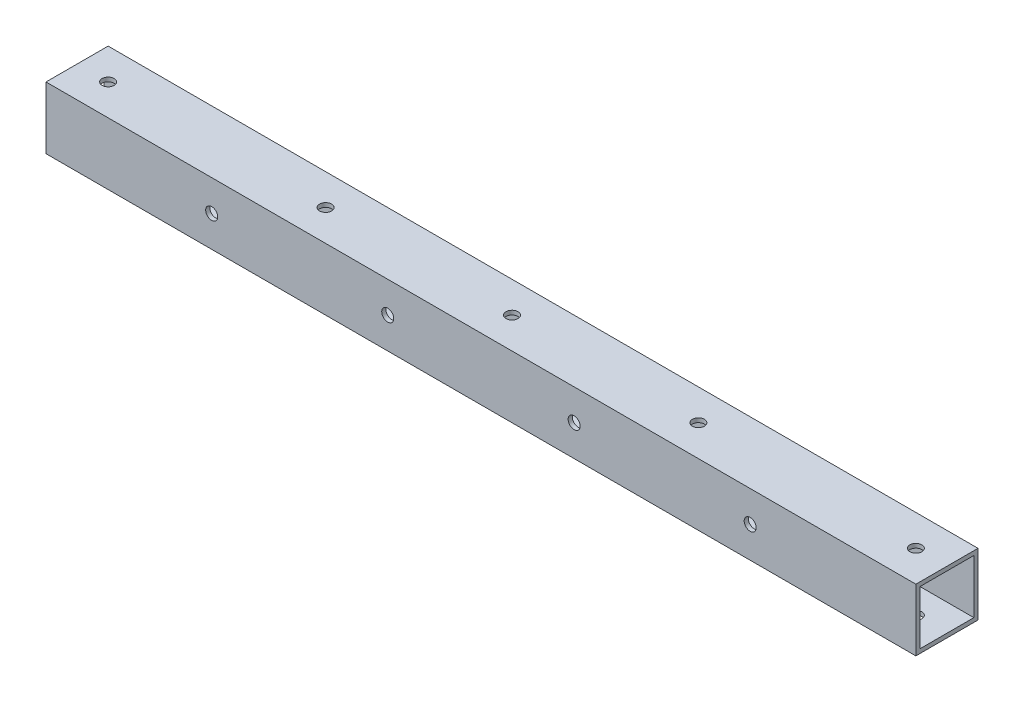
ISO-10303-21;
HEADER;
FILE_DESCRIPTION(('STEP AP214'),'2;1');
FILE_NAME('part.step','',(''),(''),'','','');
FILE_SCHEMA(('AUTOMOTIVE_DESIGN { 1 0 10303 214 1 1 1 1 }'));
ENDSEC;
DATA;
#1=APPLICATION_CONTEXT('core data for automotive mechanical design processes');
#2=APPLICATION_PROTOCOL_DEFINITION('international standard','automotive_design',2000,#1);
#3=PRODUCT_CONTEXT('',#1,'mechanical');
#4=PRODUCT('Part','Part','',(#3));
#5=PRODUCT_RELATED_PRODUCT_CATEGORY('part','',(#4));
#6=PRODUCT_DEFINITION_FORMATION('','',#4);
#7=PRODUCT_DEFINITION_CONTEXT('part definition',#1,'design');
#8=PRODUCT_DEFINITION('design','',#6,#7);
#9=PRODUCT_DEFINITION_SHAPE('','',#8);
#10=(LENGTH_UNIT() NAMED_UNIT(*) SI_UNIT(.MILLI.,.METRE.));
#11=(NAMED_UNIT(*) PLANE_ANGLE_UNIT() SI_UNIT($,.RADIAN.));
#12=(NAMED_UNIT(*) SI_UNIT($,.STERADIAN.) SOLID_ANGLE_UNIT());
#13=UNCERTAINTY_MEASURE_WITH_UNIT(LENGTH_MEASURE(1.E-05),#10,'distance_accuracy_value','');
#14=(GEOMETRIC_REPRESENTATION_CONTEXT(3) GLOBAL_UNCERTAINTY_ASSIGNED_CONTEXT((#13)) GLOBAL_UNIT_ASSIGNED_CONTEXT((#10,
#11,#12)) REPRESENTATION_CONTEXT('',''));
#15=CARTESIAN_POINT('',(0.,0.,0.));
#16=DIRECTION('',(0.,0.,1.));
#17=DIRECTION('',(1.,0.,0.));
#18=AXIS2_PLACEMENT_3D('',#15,#16,#17);
#19=CARTESIAN_POINT('',(105.,-6.50000000000001,-6.49999999999999));
#20=DIRECTION('',(0.,0.,1.));
#21=DIRECTION('',(1.,0.,0.));
#22=AXIS2_PLACEMENT_3D('',#19,#20,#21);
#23=PLANE('',#22);
#24=CARTESIAN_POINT('',(-65.,0.,-6.49999999999999));
#25=DIRECTION('',(0.,0.,1.));
#26=DIRECTION('',(1.,0.,0.));
#27=AXIS2_PLACEMENT_3D('',#24,#25,#26);
#28=CIRCLE('',#27,1.45);
#29=CARTESIAN_POINT('',(-63.55,0.,-6.49999999999999));
#30=VERTEX_POINT('',#29);
#31=EDGE_CURVE('E168',#30,#30,#28,.T.);
#32=ORIENTED_EDGE('',*,*,#31,.F.);
#33=EDGE_LOOP('',(#32));
#34=FACE_BOUND('',#33,.T.);
#35=CARTESIAN_POINT('',(22.5,0.,-6.49999999999999));
#36=DIRECTION('',(0.,0.,1.));
#37=DIRECTION('',(1.,0.,0.));
#38=AXIS2_PLACEMENT_3D('',#35,#36,#37);
#39=CIRCLE('',#38,1.45);
#40=CARTESIAN_POINT('',(23.95,0.,-6.49999999999999));
#41=VERTEX_POINT('',#40);
#42=EDGE_CURVE('E339',#41,#41,#39,.T.);
#43=ORIENTED_EDGE('',*,*,#42,.F.);
#44=EDGE_LOOP('',(#43));
#45=FACE_BOUND('',#44,.T.);
#46=CARTESIAN_POINT('',(65.,0.,-6.49999999999999));
#47=DIRECTION('',(0.,0.,1.));
#48=DIRECTION('',(1.,0.,0.));
#49=AXIS2_PLACEMENT_3D('',#46,#47,#48);
#50=CIRCLE('',#49,1.45);
#51=CARTESIAN_POINT('',(66.45,0.,-6.49999999999999));
#52=VERTEX_POINT('',#51);
#53=EDGE_CURVE('E331',#52,#52,#50,.T.);
#54=ORIENTED_EDGE('',*,*,#53,.F.);
#55=EDGE_LOOP('',(#54));
#56=FACE_BOUND('',#55,.T.);
#57=CARTESIAN_POINT('',(-22.5,0.,-6.49999999999999));
#58=DIRECTION('',(0.,0.,1.));
#59=DIRECTION('',(1.,0.,0.));
#60=AXIS2_PLACEMENT_3D('',#57,#58,#59);
#61=CIRCLE('',#60,1.45);
#62=CARTESIAN_POINT('',(-21.05,0.,-6.49999999999999));
#63=VERTEX_POINT('',#62);
#64=EDGE_CURVE('E323',#63,#63,#61,.T.);
#65=ORIENTED_EDGE('',*,*,#64,.F.);
#66=EDGE_LOOP('',(#65));
#67=FACE_BOUND('',#66,.T.);
#68=DIRECTION('',(0.,1.,0.));
#69=VECTOR('',#68,1.);
#70=CARTESIAN_POINT('',(-105.,-6.50000000000001,-6.49999999999999));
#71=LINE('',#70,#69);
#72=CARTESIAN_POINT('',(-105.,-6.50000000000001,-6.49999999999999));
#73=VERTEX_POINT('',#72);
#74=CARTESIAN_POINT('',(-105.,6.49999999999999,-6.49999999999999));
#75=VERTEX_POINT('',#74);
#76=EDGE_CURVE('E177',#73,#75,#71,.T.);
#77=ORIENTED_EDGE('',*,*,#76,.F.);
#78=DIRECTION('',(-1.,0.,0.));
#79=VECTOR('',#78,1.);
#80=CARTESIAN_POINT('',(105.,-6.50000000000001,-6.49999999999999));
#81=LINE('',#80,#79);
#82=CARTESIAN_POINT('',(105.,-6.50000000000001,-6.49999999999999));
#83=VERTEX_POINT('',#82);
#84=EDGE_CURVE('E12',#83,#73,#81,.T.);
#85=ORIENTED_EDGE('',*,*,#84,.F.);
#86=DIRECTION('',(0.,1.,0.));
#87=VECTOR('',#86,1.);
#88=CARTESIAN_POINT('',(105.,-6.50000000000001,-6.49999999999999));
#89=LINE('',#88,#87);
#90=CARTESIAN_POINT('',(105.,6.49999999999999,-6.49999999999999));
#91=VERTEX_POINT('',#90);
#92=EDGE_CURVE('E151',#83,#91,#89,.T.);
#93=ORIENTED_EDGE('',*,*,#92,.T.);
#94=DIRECTION('',(-1.,0.,0.));
#95=VECTOR('',#94,1.);
#96=CARTESIAN_POINT('',(105.,6.49999999999999,-6.49999999999999));
#97=LINE('',#96,#95);
#98=EDGE_CURVE('E81',#91,#75,#97,.T.);
#99=ORIENTED_EDGE('',*,*,#98,.T.);
#100=EDGE_LOOP('',(#77,#85,#93,#99));
#101=FACE_BOUND('',#100,.T.);
#102=ADVANCED_FACE('F61',(#34,#45,#56,#67,#101),#23,.T.);
#103=CARTESIAN_POINT('',(105.,-6.50000000000001,6.50000000000001));
#104=DIRECTION('',(0.,1.,0.));
#105=DIRECTION('',(0.,0.,1.));
#106=AXIS2_PLACEMENT_3D('',#103,#104,#105);
#107=PLANE('',#106);
#108=CARTESIAN_POINT('',(-97.5,-6.50000000000001,0.));
#109=DIRECTION('',(0.,1.,0.));
#110=DIRECTION('',(0.,0.,1.));
#111=AXIS2_PLACEMENT_3D('',#108,#109,#110);
#112=CIRCLE('',#111,1.45);
#113=CARTESIAN_POINT('',(-97.5,-6.50000000000001,1.45));
#114=VERTEX_POINT('',#113);
#115=EDGE_CURVE('E251',#114,#114,#112,.T.);
#116=ORIENTED_EDGE('',*,*,#115,.F.);
#117=EDGE_LOOP('',(#116));
#118=FACE_BOUND('',#117,.T.);
#119=CARTESIAN_POINT('',(97.5,-6.50000000000001,0.));
#120=DIRECTION('',(0.,1.,0.));
#121=DIRECTION('',(0.,0.,1.));
#122=AXIS2_PLACEMENT_3D('',#119,#120,#121);
#123=CIRCLE('',#122,1.45);
#124=CARTESIAN_POINT('',(97.5,-6.50000000000001,1.45));
#125=VERTEX_POINT('',#124);
#126=EDGE_CURVE('E226',#125,#125,#123,.T.);
#127=ORIENTED_EDGE('',*,*,#126,.F.);
#128=EDGE_LOOP('',(#127));
#129=FACE_BOUND('',#128,.T.);
#130=CARTESIAN_POINT('',(-45.,-6.50000000000001,0.));
#131=DIRECTION('',(0.,1.,0.));
#132=DIRECTION('',(0.,0.,1.));
#133=AXIS2_PLACEMENT_3D('',#130,#131,#132);
#134=CIRCLE('',#133,1.45);
#135=CARTESIAN_POINT('',(-45.,-6.50000000000001,1.45));
#136=VERTEX_POINT('',#135);
#137=EDGE_CURVE('E222',#136,#136,#134,.T.);
#138=ORIENTED_EDGE('',*,*,#137,.F.);
#139=EDGE_LOOP('',(#138));
#140=FACE_BOUND('',#139,.T.);
#141=CARTESIAN_POINT('',(45.,-6.50000000000001,0.));
#142=DIRECTION('',(0.,1.,0.));
#143=DIRECTION('',(0.,0.,1.));
#144=AXIS2_PLACEMENT_3D('',#141,#142,#143);
#145=CIRCLE('',#144,1.45);
#146=CARTESIAN_POINT('',(45.,-6.50000000000001,1.45));
#147=VERTEX_POINT('',#146);
#148=EDGE_CURVE('E218',#147,#147,#145,.T.);
#149=ORIENTED_EDGE('',*,*,#148,.F.);
#150=EDGE_LOOP('',(#149));
#151=FACE_BOUND('',#150,.T.);
#152=CARTESIAN_POINT('',(0.,-6.50000000000001,0.));
#153=DIRECTION('',(0.,1.,0.));
#154=DIRECTION('',(0.,0.,1.));
#155=AXIS2_PLACEMENT_3D('',#152,#153,#154);
#156=CIRCLE('',#155,1.45);
#157=CARTESIAN_POINT('',(0.,-6.50000000000001,1.45));
#158=VERTEX_POINT('',#157);
#159=EDGE_CURVE('E212',#158,#158,#156,.T.);
#160=ORIENTED_EDGE('',*,*,#159,.F.);
#161=EDGE_LOOP('',(#160));
#162=FACE_BOUND('',#161,.T.);
#163=DIRECTION('',(0.,0.,-1.));
#164=VECTOR('',#163,1.);
#165=CARTESIAN_POINT('',(-105.,-6.50000000000001,6.50000000000001));
#166=LINE('',#165,#164);
#167=CARTESIAN_POINT('',(-105.,-6.50000000000001,6.50000000000001));
#168=VERTEX_POINT('',#167);
#169=EDGE_CURVE('E139',#168,#73,#166,.T.);
#170=ORIENTED_EDGE('',*,*,#169,.F.);
#171=DIRECTION('',(-1.,0.,0.));
#172=VECTOR('',#171,1.);
#173=CARTESIAN_POINT('',(105.,-6.50000000000001,6.50000000000001));
#174=LINE('',#173,#172);
#175=CARTESIAN_POINT('',(105.,-6.50000000000001,6.50000000000001));
#176=VERTEX_POINT('',#175);
#177=EDGE_CURVE('E72',#176,#168,#174,.T.);
#178=ORIENTED_EDGE('',*,*,#177,.F.);
#179=DIRECTION('',(0.,0.,-1.));
#180=VECTOR('',#179,1.);
#181=CARTESIAN_POINT('',(105.,-6.50000000000001,6.50000000000001));
#182=LINE('',#181,#180);
#183=EDGE_CURVE('E137',#176,#83,#182,.T.);
#184=ORIENTED_EDGE('',*,*,#183,.T.);
#185=ORIENTED_EDGE('',*,*,#84,.T.);
#186=EDGE_LOOP('',(#170,#178,#184,#185));
#187=FACE_BOUND('',#186,.T.);
#188=ADVANCED_FACE('F136',(#118,#129,#140,#151,#162,#187),#107,.T.);
#189=CARTESIAN_POINT('',(105.,-6.50000000000001,6.50000000000001));
#190=DIRECTION('',(0.,0.,-1.));
#191=DIRECTION('',(-1.,0.,0.));
#192=AXIS2_PLACEMENT_3D('',#189,#190,#191);
#193=PLANE('',#192);
#194=CARTESIAN_POINT('',(-65.,0.,6.50000000000001));
#195=DIRECTION('',(0.,0.,-1.));
#196=DIRECTION('',(-1.,0.,0.));
#197=AXIS2_PLACEMENT_3D('',#194,#195,#196);
#198=CIRCLE('',#197,1.45);
#199=CARTESIAN_POINT('',(-66.45,0.,6.50000000000001));
#200=VERTEX_POINT('',#199);
#201=EDGE_CURVE('E343',#200,#200,#198,.T.);
#202=ORIENTED_EDGE('',*,*,#201,.F.);
#203=EDGE_LOOP('',(#202));
#204=FACE_BOUND('',#203,.T.);
#205=CARTESIAN_POINT('',(22.5,0.,6.50000000000001));
#206=DIRECTION('',(0.,0.,-1.));
#207=DIRECTION('',(-1.,0.,0.));
#208=AXIS2_PLACEMENT_3D('',#205,#206,#207);
#209=CIRCLE('',#208,1.45);
#210=CARTESIAN_POINT('',(21.05,0.,6.50000000000001));
#211=VERTEX_POINT('',#210);
#212=EDGE_CURVE('E335',#211,#211,#209,.T.);
#213=ORIENTED_EDGE('',*,*,#212,.F.);
#214=EDGE_LOOP('',(#213));
#215=FACE_BOUND('',#214,.T.);
#216=CARTESIAN_POINT('',(65.,0.,6.50000000000001));
#217=DIRECTION('',(0.,0.,-1.));
#218=DIRECTION('',(-1.,0.,0.));
#219=AXIS2_PLACEMENT_3D('',#216,#217,#218);
#220=CIRCLE('',#219,1.45);
#221=CARTESIAN_POINT('',(63.55,0.,6.50000000000001));
#222=VERTEX_POINT('',#221);
#223=EDGE_CURVE('E327',#222,#222,#220,.T.);
#224=ORIENTED_EDGE('',*,*,#223,.F.);
#225=EDGE_LOOP('',(#224));
#226=FACE_BOUND('',#225,.T.);
#227=CARTESIAN_POINT('',(-22.5,0.,6.50000000000001));
#228=DIRECTION('',(0.,0.,-1.));
#229=DIRECTION('',(-1.,0.,0.));
#230=AXIS2_PLACEMENT_3D('',#227,#228,#229);
#231=CIRCLE('',#230,1.45);
#232=CARTESIAN_POINT('',(-23.95,0.,6.50000000000001));
#233=VERTEX_POINT('',#232);
#234=EDGE_CURVE('E292',#233,#233,#231,.T.);
#235=ORIENTED_EDGE('',*,*,#234,.F.);
#236=EDGE_LOOP('',(#235));
#237=FACE_BOUND('',#236,.T.);
#238=DIRECTION('',(0.,-1.,0.));
#239=VECTOR('',#238,1.);
#240=CARTESIAN_POINT('',(-105.,-6.50000000000001,6.50000000000001));
#241=LINE('',#240,#239);
#242=CARTESIAN_POINT('',(-105.,6.49999999999999,6.50000000000001));
#243=VERTEX_POINT('',#242);
#244=EDGE_CURVE('E182',#243,#168,#241,.T.);
#245=ORIENTED_EDGE('',*,*,#244,.F.);
#246=DIRECTION('',(-1.,0.,0.));
#247=VECTOR('',#246,1.);
#248=CARTESIAN_POINT('',(105.,6.49999999999999,6.50000000000001));
#249=LINE('',#248,#247);
#250=CARTESIAN_POINT('',(105.,6.49999999999999,6.50000000000001));
#251=VERTEX_POINT('',#250);
#252=EDGE_CURVE('E106',#251,#243,#249,.T.);
#253=ORIENTED_EDGE('',*,*,#252,.F.);
#254=DIRECTION('',(0.,-1.,0.));
#255=VECTOR('',#254,1.);
#256=CARTESIAN_POINT('',(105.,-6.50000000000001,6.50000000000001));
#257=LINE('',#256,#255);
#258=EDGE_CURVE('E150',#251,#176,#257,.T.);
#259=ORIENTED_EDGE('',*,*,#258,.T.);
#260=ORIENTED_EDGE('',*,*,#177,.T.);
#261=EDGE_LOOP('',(#245,#253,#259,#260));
#262=FACE_BOUND('',#261,.T.);
#263=ADVANCED_FACE('F154',(#204,#215,#226,#237,#262),#193,.T.);
#264=CARTESIAN_POINT('',(105.,-7.50000000000001,-7.49999999999999));
#265=DIRECTION('',(0.,0.,1.));
#266=DIRECTION('',(1.,0.,0.));
#267=AXIS2_PLACEMENT_3D('',#264,#265,#266);
#268=PLANE('',#267);
#269=CARTESIAN_POINT('',(-65.,0.,-7.49999999999999));
#270=DIRECTION('',(0.,0.,-1.));
#271=DIRECTION('',(-1.,0.,0.));
#272=AXIS2_PLACEMENT_3D('',#269,#270,#271);
#273=CIRCLE('',#272,1.45);
#274=CARTESIAN_POINT('',(-66.45,0.,-7.49999999999999));
#275=VERTEX_POINT('',#274);
#276=EDGE_CURVE('E293',#275,#275,#273,.T.);
#277=ORIENTED_EDGE('',*,*,#276,.F.);
#278=EDGE_LOOP('',(#277));
#279=FACE_BOUND('',#278,.T.);
#280=CARTESIAN_POINT('',(22.5,0.,-7.49999999999999));
#281=DIRECTION('',(0.,0.,-1.));
#282=DIRECTION('',(1.,0.,0.));
#283=AXIS2_PLACEMENT_3D('',#280,#281,#282);
#284=CIRCLE('',#283,1.45);
#285=CARTESIAN_POINT('',(23.95,0.,-7.49999999999999));
#286=VERTEX_POINT('',#285);
#287=EDGE_CURVE('E298',#286,#286,#284,.T.);
#288=ORIENTED_EDGE('',*,*,#287,.F.);
#289=EDGE_LOOP('',(#288));
#290=FACE_BOUND('',#289,.T.);
#291=CARTESIAN_POINT('',(65.,0.,-7.49999999999999));
#292=DIRECTION('',(0.,0.,-1.));
#293=DIRECTION('',(1.,0.,0.));
#294=AXIS2_PLACEMENT_3D('',#291,#292,#293);
#295=CIRCLE('',#294,1.45);
#296=CARTESIAN_POINT('',(66.45,0.,-7.49999999999999));
#297=VERTEX_POINT('',#296);
#298=EDGE_CURVE('E313',#297,#297,#295,.T.);
#299=ORIENTED_EDGE('',*,*,#298,.F.);
#300=EDGE_LOOP('',(#299));
#301=FACE_BOUND('',#300,.T.);
#302=CARTESIAN_POINT('',(-22.5,0.,-7.49999999999999));
#303=DIRECTION('',(0.,0.,-1.));
#304=DIRECTION('',(-1.,0.,0.));
#305=AXIS2_PLACEMENT_3D('',#302,#303,#304);
#306=CIRCLE('',#305,1.45);
#307=CARTESIAN_POINT('',(-23.95,0.,-7.49999999999999));
#308=VERTEX_POINT('',#307);
#309=EDGE_CURVE('E297',#308,#308,#306,.T.);
#310=ORIENTED_EDGE('',*,*,#309,.F.);
#311=EDGE_LOOP('',(#310));
#312=FACE_BOUND('',#311,.T.);
#313=DIRECTION('',(0.,1.,0.));
#314=VECTOR('',#313,1.);
#315=CARTESIAN_POINT('',(-105.,-7.50000000000001,-7.49999999999999));
#316=LINE('',#315,#314);
#317=CARTESIAN_POINT('',(-105.,-7.50000000000001,-7.49999999999999));
#318=VERTEX_POINT('',#317);
#319=CARTESIAN_POINT('',(-105.,7.49999999999999,-7.49999999999999));
#320=VERTEX_POINT('',#319);
#321=EDGE_CURVE('E163',#318,#320,#316,.T.);
#322=ORIENTED_EDGE('',*,*,#321,.T.);
#323=DIRECTION('',(-1.,0.,0.));
#324=VECTOR('',#323,1.);
#325=CARTESIAN_POINT('',(105.,7.49999999999999,-7.49999999999999));
#326=LINE('',#325,#324);
#327=CARTESIAN_POINT('',(105.,7.49999999999999,-7.49999999999999));
#328=VERTEX_POINT('',#327);
#329=EDGE_CURVE('E192',#328,#320,#326,.T.);
#330=ORIENTED_EDGE('',*,*,#329,.F.);
#331=DIRECTION('',(0.,1.,0.));
#332=VECTOR('',#331,1.);
#333=CARTESIAN_POINT('',(105.,-7.50000000000001,-7.49999999999999));
#334=LINE('',#333,#332);
#335=CARTESIAN_POINT('',(105.,-7.50000000000001,-7.49999999999999));
#336=VERTEX_POINT('',#335);
#337=EDGE_CURVE('E189',#336,#328,#334,.T.);
#338=ORIENTED_EDGE('',*,*,#337,.F.);
#339=DIRECTION('',(-1.,0.,0.));
#340=VECTOR('',#339,1.);
#341=CARTESIAN_POINT('',(105.,-7.50000000000001,-7.49999999999999));
#342=LINE('',#341,#340);
#343=EDGE_CURVE('E159',#336,#318,#342,.T.);
#344=ORIENTED_EDGE('',*,*,#343,.T.);
#345=EDGE_LOOP('',(#322,#330,#338,#344));
#346=FACE_BOUND('',#345,.T.);
#347=ADVANCED_FACE('F63',(#279,#290,#301,#312,#346),#268,.F.);
#348=CARTESIAN_POINT('',(105.,7.49999999999999,7.50000000000001));
#349=DIRECTION('',(0.,-1.,0.));
#350=DIRECTION('',(0.,0.,-1.));
#351=AXIS2_PLACEMENT_3D('',#348,#349,#350);
#352=PLANE('',#351);
#353=CARTESIAN_POINT('',(-97.5,7.49999999999999,0.));
#354=DIRECTION('',(0.,-1.,0.));
#355=DIRECTION('',(0.,0.,-1.));
#356=AXIS2_PLACEMENT_3D('',#353,#354,#355);
#357=CIRCLE('',#356,1.45);
#358=CARTESIAN_POINT('',(-97.5,7.49999999999999,-1.45));
#359=VERTEX_POINT('',#358);
#360=EDGE_CURVE('E227',#359,#359,#357,.T.);
#361=ORIENTED_EDGE('',*,*,#360,.T.);
#362=EDGE_LOOP('',(#361));
#363=FACE_BOUND('',#362,.T.);
#364=CARTESIAN_POINT('',(97.5,7.49999999999999,0.));
#365=DIRECTION('',(0.,-1.,0.));
#366=DIRECTION('',(0.,0.,-1.));
#367=AXIS2_PLACEMENT_3D('',#364,#365,#366);
#368=CIRCLE('',#367,1.45);
#369=CARTESIAN_POINT('',(97.5,7.49999999999999,-1.45));
#370=VERTEX_POINT('',#369);
#371=EDGE_CURVE('E247',#370,#370,#368,.T.);
#372=ORIENTED_EDGE('',*,*,#371,.T.);
#373=EDGE_LOOP('',(#372));
#374=FACE_BOUND('',#373,.T.);
#375=CARTESIAN_POINT('',(-45.,7.49999999999999,0.));
#376=DIRECTION('',(0.,1.,0.));
#377=DIRECTION('',(0.,0.,-1.));
#378=AXIS2_PLACEMENT_3D('',#375,#376,#377);
#379=CIRCLE('',#378,1.45);
#380=CARTESIAN_POINT('',(-45.,7.49999999999999,-1.45));
#381=VERTEX_POINT('',#380);
#382=EDGE_CURVE('E265',#381,#381,#379,.T.);
#383=ORIENTED_EDGE('',*,*,#382,.F.);
#384=EDGE_LOOP('',(#383));
#385=FACE_BOUND('',#384,.T.);
#386=CARTESIAN_POINT('',(45.,7.49999999999999,0.));
#387=DIRECTION('',(0.,1.,0.));
#388=DIRECTION('',(0.,0.,1.));
#389=AXIS2_PLACEMENT_3D('',#386,#387,#388);
#390=CIRCLE('',#389,1.45);
#391=CARTESIAN_POINT('',(45.,7.49999999999999,1.45));
#392=VERTEX_POINT('',#391);
#393=EDGE_CURVE('E256',#392,#392,#390,.T.);
#394=ORIENTED_EDGE('',*,*,#393,.F.);
#395=EDGE_LOOP('',(#394));
#396=FACE_BOUND('',#395,.T.);
#397=CARTESIAN_POINT('',(0.,7.49999999999999,0.));
#398=DIRECTION('',(0.,1.,0.));
#399=DIRECTION('',(0.,0.,1.));
#400=AXIS2_PLACEMENT_3D('',#397,#398,#399);
#401=CIRCLE('',#400,1.45);
#402=CARTESIAN_POINT('',(0.,7.49999999999999,1.45));
#403=VERTEX_POINT('',#402);
#404=EDGE_CURVE('E260',#403,#403,#401,.T.);
#405=ORIENTED_EDGE('',*,*,#404,.F.);
#406=EDGE_LOOP('',(#405));
#407=FACE_BOUND('',#406,.T.);
#408=DIRECTION('',(0.,0.,1.));
#409=VECTOR('',#408,1.);
#410=CARTESIAN_POINT('',(-105.,7.49999999999999,7.50000000000001));
#411=LINE('',#410,#409);
#412=CARTESIAN_POINT('',(-105.,7.49999999999999,7.50000000000001));
#413=VERTEX_POINT('',#412);
#414=EDGE_CURVE('E167',#320,#413,#411,.T.);
#415=ORIENTED_EDGE('',*,*,#414,.T.);
#416=DIRECTION('',(-1.,0.,0.));
#417=VECTOR('',#416,1.);
#418=CARTESIAN_POINT('',(105.,7.49999999999999,7.50000000000001));
#419=LINE('',#418,#417);
#420=CARTESIAN_POINT('',(105.,7.49999999999999,7.50000000000001));
#421=VERTEX_POINT('',#420);
#422=EDGE_CURVE('E202',#421,#413,#419,.T.);
#423=ORIENTED_EDGE('',*,*,#422,.F.);
#424=DIRECTION('',(0.,0.,1.));
#425=VECTOR('',#424,1.);
#426=CARTESIAN_POINT('',(105.,7.49999999999999,7.50000000000001));
#427=LINE('',#426,#425);
#428=EDGE_CURVE('E119',#328,#421,#427,.T.);
#429=ORIENTED_EDGE('',*,*,#428,.F.);
#430=ORIENTED_EDGE('',*,*,#329,.T.);
#431=EDGE_LOOP('',(#415,#423,#429,#430));
#432=FACE_BOUND('',#431,.T.);
#433=ADVANCED_FACE('F394',(#363,#374,#385,#396,#407,#432),#352,.F.);
#434=CARTESIAN_POINT('',(105.,-7.50000000000001,7.49999999999999));
#435=DIRECTION('',(0.,0.,-1.));
#436=DIRECTION('',(0.,1.,0.));
#437=AXIS2_PLACEMENT_3D('',#434,#435,#436);
#438=PLANE('',#437);
#439=CARTESIAN_POINT('',(-65.,0.,7.50000000000001));
#440=DIRECTION('',(0.,0.,-1.));
#441=DIRECTION('',(-1.,0.,0.));
#442=AXIS2_PLACEMENT_3D('',#439,#440,#441);
#443=CIRCLE('',#442,1.45);
#444=CARTESIAN_POINT('',(-66.45,0.,7.50000000000001));
#445=VERTEX_POINT('',#444);
#446=EDGE_CURVE('E288',#445,#445,#443,.T.);
#447=ORIENTED_EDGE('',*,*,#446,.T.);
#448=EDGE_LOOP('',(#447));
#449=FACE_BOUND('',#448,.T.);
#450=CARTESIAN_POINT('',(22.5,0.,7.50000000000001));
#451=DIRECTION('',(0.,0.,-1.));
#452=DIRECTION('',(1.,0.,0.));
#453=AXIS2_PLACEMENT_3D('',#450,#451,#452);
#454=CIRCLE('',#453,1.45);
#455=CARTESIAN_POINT('',(23.95,0.,7.50000000000001));
#456=VERTEX_POINT('',#455);
#457=EDGE_CURVE('E287',#456,#456,#454,.T.);
#458=ORIENTED_EDGE('',*,*,#457,.T.);
#459=EDGE_LOOP('',(#458));
#460=FACE_BOUND('',#459,.T.);
#461=CARTESIAN_POINT('',(65.,0.,7.50000000000001));
#462=DIRECTION('',(0.,0.,-1.));
#463=DIRECTION('',(1.,0.,0.));
#464=AXIS2_PLACEMENT_3D('',#461,#462,#463);
#465=CIRCLE('',#464,1.45);
#466=CARTESIAN_POINT('',(66.45,0.,7.50000000000001));
#467=VERTEX_POINT('',#466);
#468=EDGE_CURVE('E302',#467,#467,#465,.T.);
#469=ORIENTED_EDGE('',*,*,#468,.T.);
#470=EDGE_LOOP('',(#469));
#471=FACE_BOUND('',#470,.T.);
#472=CARTESIAN_POINT('',(-22.5,0.,7.50000000000001));
#473=DIRECTION('',(0.,0.,-1.));
#474=DIRECTION('',(-1.,0.,0.));
#475=AXIS2_PLACEMENT_3D('',#472,#473,#474);
#476=CIRCLE('',#475,1.45);
#477=CARTESIAN_POINT('',(-23.95,0.,7.50000000000001));
#478=VERTEX_POINT('',#477);
#479=EDGE_CURVE('E309',#478,#478,#476,.T.);
#480=ORIENTED_EDGE('',*,*,#479,.T.);
#481=EDGE_LOOP('',(#480));
#482=FACE_BOUND('',#481,.T.);
#483=DIRECTION('',(0.,-1.,0.));
#484=VECTOR('',#483,1.);
#485=CARTESIAN_POINT('',(-105.,-7.50000000000001,7.49999999999999));
#486=LINE('',#485,#484);
#487=CARTESIAN_POINT('',(-105.,-7.50000000000001,7.49999999999999));
#488=VERTEX_POINT('',#487);
#489=EDGE_CURVE('E171',#413,#488,#486,.T.);
#490=ORIENTED_EDGE('',*,*,#489,.T.);
#491=DIRECTION('',(-1.,0.,0.));
#492=VECTOR('',#491,1.);
#493=CARTESIAN_POINT('',(105.,-7.50000000000001,7.49999999999999));
#494=LINE('',#493,#492);
#495=CARTESIAN_POINT('',(105.,-7.50000000000001,7.49999999999999));
#496=VERTEX_POINT('',#495);
#497=EDGE_CURVE('E198',#496,#488,#494,.T.);
#498=ORIENTED_EDGE('',*,*,#497,.F.);
#499=DIRECTION('',(0.,-1.,0.));
#500=VECTOR('',#499,1.);
#501=CARTESIAN_POINT('',(105.,-7.50000000000001,7.49999999999999));
#502=LINE('',#501,#500);
#503=EDGE_CURVE('E354',#421,#496,#502,.T.);
#504=ORIENTED_EDGE('',*,*,#503,.F.);
#505=ORIENTED_EDGE('',*,*,#422,.T.);
#506=EDGE_LOOP('',(#490,#498,#504,#505));
#507=FACE_BOUND('',#506,.T.);
#508=ADVANCED_FACE('F373',(#449,#460,#471,#482,#507),#438,.F.);
#509=CARTESIAN_POINT('',(105.,-7.50000000000001,7.49999999999999));
#510=DIRECTION('',(0.,1.,0.));
#511=DIRECTION('',(0.,0.,1.));
#512=AXIS2_PLACEMENT_3D('',#509,#510,#511);
#513=PLANE('',#512);
#514=CARTESIAN_POINT('',(-97.5,-7.50000000000001,0.));
#515=DIRECTION('',(0.,-1.,0.));
#516=DIRECTION('',(0.,0.,-1.));
#517=AXIS2_PLACEMENT_3D('',#514,#515,#516);
#518=CIRCLE('',#517,1.45);
#519=CARTESIAN_POINT('',(-97.5,-7.50000000000001,-1.45));
#520=VERTEX_POINT('',#519);
#521=EDGE_CURVE('E235',#520,#520,#518,.T.);
#522=ORIENTED_EDGE('',*,*,#521,.F.);
#523=EDGE_LOOP('',(#522));
#524=FACE_BOUND('',#523,.T.);
#525=CARTESIAN_POINT('',(97.5,-7.50000000000001,0.));
#526=DIRECTION('',(0.,-1.,0.));
#527=DIRECTION('',(0.,0.,-1.));
#528=AXIS2_PLACEMENT_3D('',#525,#526,#527);
#529=CIRCLE('',#528,1.45);
#530=CARTESIAN_POINT('',(97.5,-7.50000000000001,-1.45));
#531=VERTEX_POINT('',#530);
#532=EDGE_CURVE('E241',#531,#531,#529,.T.);
#533=ORIENTED_EDGE('',*,*,#532,.F.);
#534=EDGE_LOOP('',(#533));
#535=FACE_BOUND('',#534,.T.);
#536=CARTESIAN_POINT('',(-45.,-7.50000000000001,0.));
#537=DIRECTION('',(0.,1.,0.));
#538=DIRECTION('',(0.,0.,-1.));
#539=AXIS2_PLACEMENT_3D('',#536,#537,#538);
#540=CIRCLE('',#539,1.45);
#541=CARTESIAN_POINT('',(-45.,-7.50000000000001,-1.45));
#542=VERTEX_POINT('',#541);
#543=EDGE_CURVE('E255',#542,#542,#540,.T.);
#544=ORIENTED_EDGE('',*,*,#543,.T.);
#545=EDGE_LOOP('',(#544));
#546=FACE_BOUND('',#545,.T.);
#547=CARTESIAN_POINT('',(45.,-7.50000000000001,0.));
#548=DIRECTION('',(0.,1.,0.));
#549=DIRECTION('',(0.,0.,1.));
#550=AXIS2_PLACEMENT_3D('',#547,#548,#549);
#551=CIRCLE('',#550,1.45);
#552=CARTESIAN_POINT('',(45.,-7.50000000000001,1.45));
#553=VERTEX_POINT('',#552);
#554=EDGE_CURVE('E261',#553,#553,#551,.T.);
#555=ORIENTED_EDGE('',*,*,#554,.T.);
#556=EDGE_LOOP('',(#555));
#557=FACE_BOUND('',#556,.T.);
#558=CARTESIAN_POINT('',(0.,-7.50000000000001,0.));
#559=DIRECTION('',(0.,1.,0.));
#560=DIRECTION('',(0.,0.,1.));
#561=AXIS2_PLACEMENT_3D('',#558,#559,#560);
#562=CIRCLE('',#561,1.45);
#563=CARTESIAN_POINT('',(0.,-7.50000000000001,1.45));
#564=VERTEX_POINT('',#563);
#565=EDGE_CURVE('E213',#564,#564,#562,.T.);
#566=ORIENTED_EDGE('',*,*,#565,.T.);
#567=EDGE_LOOP('',(#566));
#568=FACE_BOUND('',#567,.T.);
#569=DIRECTION('',(0.,0.,-1.));
#570=VECTOR('',#569,1.);
#571=CARTESIAN_POINT('',(-105.,-7.50000000000001,7.49999999999999));
#572=LINE('',#571,#570);
#573=EDGE_CURVE('E174',#488,#318,#572,.T.);
#574=ORIENTED_EDGE('',*,*,#573,.T.);
#575=ORIENTED_EDGE('',*,*,#343,.F.);
#576=DIRECTION('',(0.,0.,-1.));
#577=VECTOR('',#576,1.);
#578=CARTESIAN_POINT('',(105.,-7.50000000000001,7.49999999999999));
#579=LINE('',#578,#577);
#580=EDGE_CURVE('E357',#496,#336,#579,.T.);
#581=ORIENTED_EDGE('',*,*,#580,.F.);
#582=ORIENTED_EDGE('',*,*,#497,.T.);
#583=EDGE_LOOP('',(#574,#575,#581,#582));
#584=FACE_BOUND('',#583,.T.);
#585=ADVANCED_FACE('F362',(#524,#535,#546,#557,#568,#584),#513,.F.);
#586=CARTESIAN_POINT('',(105.,6.49999999999999,6.50000000000001));
#587=DIRECTION('',(0.,-1.,0.));
#588=DIRECTION('',(0.,0.,-1.));
#589=AXIS2_PLACEMENT_3D('',#586,#587,#588);
#590=PLANE('',#589);
#591=CARTESIAN_POINT('',(-97.5,6.49999999999999,0.));
#592=DIRECTION('',(0.,-1.,0.));
#593=DIRECTION('',(0.,0.,-1.));
#594=AXIS2_PLACEMENT_3D('',#591,#592,#593);
#595=CIRCLE('',#594,1.45);
#596=CARTESIAN_POINT('',(-97.5,6.49999999999999,-1.45));
#597=VERTEX_POINT('',#596);
#598=EDGE_CURVE('E65',#597,#597,#595,.T.);
#599=ORIENTED_EDGE('',*,*,#598,.F.);
#600=EDGE_LOOP('',(#599));
#601=FACE_BOUND('',#600,.T.);
#602=CARTESIAN_POINT('',(97.5,6.49999999999999,0.));
#603=DIRECTION('',(0.,-1.,0.));
#604=DIRECTION('',(0.,0.,-1.));
#605=AXIS2_PLACEMENT_3D('',#602,#603,#604);
#606=CIRCLE('',#605,1.45);
#607=CARTESIAN_POINT('',(97.5,6.49999999999999,-1.45));
#608=VERTEX_POINT('',#607);
#609=EDGE_CURVE('E223',#608,#608,#606,.T.);
#610=ORIENTED_EDGE('',*,*,#609,.F.);
#611=EDGE_LOOP('',(#610));
#612=FACE_BOUND('',#611,.T.);
#613=CARTESIAN_POINT('',(-45.,6.49999999999999,0.));
#614=DIRECTION('',(0.,-1.,0.));
#615=DIRECTION('',(0.,0.,-1.));
#616=AXIS2_PLACEMENT_3D('',#613,#614,#615);
#617=CIRCLE('',#616,1.45);
#618=CARTESIAN_POINT('',(-45.,6.49999999999999,-1.45));
#619=VERTEX_POINT('',#618);
#620=EDGE_CURVE('E219',#619,#619,#617,.T.);
#621=ORIENTED_EDGE('',*,*,#620,.F.);
#622=EDGE_LOOP('',(#621));
#623=FACE_BOUND('',#622,.T.);
#624=CARTESIAN_POINT('',(45.,6.49999999999999,0.));
#625=DIRECTION('',(0.,-1.,0.));
#626=DIRECTION('',(0.,0.,-1.));
#627=AXIS2_PLACEMENT_3D('',#624,#625,#626);
#628=CIRCLE('',#627,1.45);
#629=CARTESIAN_POINT('',(45.,6.49999999999999,-1.45));
#630=VERTEX_POINT('',#629);
#631=EDGE_CURVE('E214',#630,#630,#628,.T.);
#632=ORIENTED_EDGE('',*,*,#631,.F.);
#633=EDGE_LOOP('',(#632));
#634=FACE_BOUND('',#633,.T.);
#635=CARTESIAN_POINT('',(0.,6.49999999999999,0.));
#636=DIRECTION('',(0.,-1.,0.));
#637=DIRECTION('',(0.,0.,-1.));
#638=AXIS2_PLACEMENT_3D('',#635,#636,#637);
#639=CIRCLE('',#638,1.45);
#640=CARTESIAN_POINT('',(0.,6.49999999999999,-1.45));
#641=VERTEX_POINT('',#640);
#642=EDGE_CURVE('E208',#641,#641,#639,.T.);
#643=ORIENTED_EDGE('',*,*,#642,.F.);
#644=EDGE_LOOP('',(#643));
#645=FACE_BOUND('',#644,.T.);
#646=DIRECTION('',(0.,0.,1.));
#647=VECTOR('',#646,1.);
#648=CARTESIAN_POINT('',(-105.,6.49999999999999,6.50000000000001));
#649=LINE('',#648,#647);
#650=EDGE_CURVE('E185',#75,#243,#649,.T.);
#651=ORIENTED_EDGE('',*,*,#650,.F.);
#652=ORIENTED_EDGE('',*,*,#98,.F.);
#653=DIRECTION('',(0.,0.,1.));
#654=VECTOR('',#653,1.);
#655=CARTESIAN_POINT('',(105.,6.49999999999999,6.50000000000001));
#656=LINE('',#655,#654);
#657=EDGE_CURVE('E156',#91,#251,#656,.T.);
#658=ORIENTED_EDGE('',*,*,#657,.T.);
#659=ORIENTED_EDGE('',*,*,#252,.T.);
#660=EDGE_LOOP('',(#651,#652,#658,#659));
#661=FACE_BOUND('',#660,.T.);
#662=ADVANCED_FACE('F360',(#601,#612,#623,#634,#645,#661),#590,.T.);
#663=CARTESIAN_POINT('',(105.,0.,0.));
#664=DIRECTION('',(-1.,0.,0.));
#665=DIRECTION('',(0.,0.,1.));
#666=AXIS2_PLACEMENT_3D('',#663,#664,#665);
#667=PLANE('',#666);
#668=ORIENTED_EDGE('',*,*,#337,.T.);
#669=ORIENTED_EDGE('',*,*,#428,.T.);
#670=ORIENTED_EDGE('',*,*,#503,.T.);
#671=ORIENTED_EDGE('',*,*,#580,.T.);
#672=EDGE_LOOP('',(#668,#669,#670,#671));
#673=FACE_BOUND('',#672,.T.);
#674=ORIENTED_EDGE('',*,*,#92,.F.);
#675=ORIENTED_EDGE('',*,*,#183,.F.);
#676=ORIENTED_EDGE('',*,*,#258,.F.);
#677=ORIENTED_EDGE('',*,*,#657,.F.);
#678=EDGE_LOOP('',(#674,#675,#676,#677));
#679=FACE_BOUND('',#678,.T.);
#680=ADVANCED_FACE('F148',(#673,#679),#667,.F.);
#681=CARTESIAN_POINT('',(-105.,0.,0.));
#682=DIRECTION('',(-1.,0.,0.));
#683=DIRECTION('',(0.,0.,1.));
#684=AXIS2_PLACEMENT_3D('',#681,#682,#683);
#685=PLANE('',#684);
#686=ORIENTED_EDGE('',*,*,#321,.F.);
#687=ORIENTED_EDGE('',*,*,#573,.F.);
#688=ORIENTED_EDGE('',*,*,#489,.F.);
#689=ORIENTED_EDGE('',*,*,#414,.F.);
#690=EDGE_LOOP('',(#686,#687,#688,#689));
#691=FACE_BOUND('',#690,.T.);
#692=ORIENTED_EDGE('',*,*,#76,.T.);
#693=ORIENTED_EDGE('',*,*,#650,.T.);
#694=ORIENTED_EDGE('',*,*,#244,.T.);
#695=ORIENTED_EDGE('',*,*,#169,.T.);
#696=EDGE_LOOP('',(#692,#693,#694,#695));
#697=FACE_BOUND('',#696,.T.);
#698=ADVANCED_FACE('F370',(#691,#697),#685,.T.);
#699=CARTESIAN_POINT('',(-22.5,0.,7.50000000000001));
#700=DIRECTION('',(0.,0.,-1.));
#701=DIRECTION('',(-1.,0.,0.));
#702=AXIS2_PLACEMENT_3D('',#699,#700,#701);
#703=CYLINDRICAL_SURFACE('',#702,1.45);
#704=ORIENTED_EDGE('',*,*,#234,.T.);
#705=EDGE_LOOP('',(#704));
#706=FACE_BOUND('',#705,.T.);
#707=ORIENTED_EDGE('',*,*,#479,.F.);
#708=EDGE_LOOP('',(#707));
#709=FACE_BOUND('',#708,.T.);
#710=ADVANCED_FACE('F423',(#706,#709),#703,.F.);
#711=CARTESIAN_POINT('',(65.,0.,7.50000000000001));
#712=DIRECTION('',(0.,0.,-1.));
#713=DIRECTION('',(-1.,0.,0.));
#714=AXIS2_PLACEMENT_3D('',#711,#712,#713);
#715=CYLINDRICAL_SURFACE('',#714,1.45);
#716=ORIENTED_EDGE('',*,*,#223,.T.);
#717=EDGE_LOOP('',(#716));
#718=FACE_BOUND('',#717,.T.);
#719=ORIENTED_EDGE('',*,*,#468,.F.);
#720=EDGE_LOOP('',(#719));
#721=FACE_BOUND('',#720,.T.);
#722=ADVANCED_FACE('F427',(#718,#721),#715,.F.);
#723=CARTESIAN_POINT('',(22.5,0.,7.50000000000001));
#724=DIRECTION('',(0.,0.,-1.));
#725=DIRECTION('',(-1.,0.,0.));
#726=AXIS2_PLACEMENT_3D('',#723,#724,#725);
#727=CYLINDRICAL_SURFACE('',#726,1.45);
#728=ORIENTED_EDGE('',*,*,#212,.T.);
#729=EDGE_LOOP('',(#728));
#730=FACE_BOUND('',#729,.T.);
#731=ORIENTED_EDGE('',*,*,#457,.F.);
#732=EDGE_LOOP('',(#731));
#733=FACE_BOUND('',#732,.T.);
#734=ADVANCED_FACE('F433',(#730,#733),#727,.F.);
#735=CARTESIAN_POINT('',(-65.,0.,7.50000000000001));
#736=DIRECTION('',(0.,0.,-1.));
#737=DIRECTION('',(-1.,0.,0.));
#738=AXIS2_PLACEMENT_3D('',#735,#736,#737);
#739=CYLINDRICAL_SURFACE('',#738,1.45);
#740=ORIENTED_EDGE('',*,*,#201,.T.);
#741=EDGE_LOOP('',(#740));
#742=FACE_BOUND('',#741,.T.);
#743=ORIENTED_EDGE('',*,*,#446,.F.);
#744=EDGE_LOOP('',(#743));
#745=FACE_BOUND('',#744,.T.);
#746=ADVANCED_FACE('F439',(#742,#745),#739,.F.);
#747=ORIENTED_EDGE('',*,*,#64,.T.);
#748=EDGE_LOOP('',(#747));
#749=FACE_BOUND('',#748,.T.);
#750=ORIENTED_EDGE('',*,*,#309,.T.);
#751=EDGE_LOOP('',(#750));
#752=FACE_BOUND('',#751,.T.);
#753=ADVANCED_FACE('F430',(#749,#752),#703,.F.);
#754=ORIENTED_EDGE('',*,*,#53,.T.);
#755=EDGE_LOOP('',(#754));
#756=FACE_BOUND('',#755,.T.);
#757=ORIENTED_EDGE('',*,*,#298,.T.);
#758=EDGE_LOOP('',(#757));
#759=FACE_BOUND('',#758,.T.);
#760=ADVANCED_FACE('F435',(#756,#759),#715,.F.);
#761=ORIENTED_EDGE('',*,*,#42,.T.);
#762=EDGE_LOOP('',(#761));
#763=FACE_BOUND('',#762,.T.);
#764=ORIENTED_EDGE('',*,*,#287,.T.);
#765=EDGE_LOOP('',(#764));
#766=FACE_BOUND('',#765,.T.);
#767=ADVANCED_FACE('F441',(#763,#766),#727,.F.);
#768=ORIENTED_EDGE('',*,*,#31,.T.);
#769=EDGE_LOOP('',(#768));
#770=FACE_BOUND('',#769,.T.);
#771=ORIENTED_EDGE('',*,*,#276,.T.);
#772=EDGE_LOOP('',(#771));
#773=FACE_BOUND('',#772,.T.);
#774=ADVANCED_FACE('F445',(#770,#773),#739,.F.);
#775=CARTESIAN_POINT('',(0.,-7.50000000000001,0.));
#776=DIRECTION('',(0.,1.,0.));
#777=DIRECTION('',(0.,0.,1.));
#778=AXIS2_PLACEMENT_3D('',#775,#776,#777);
#779=CYLINDRICAL_SURFACE('',#778,1.45);
#780=ORIENTED_EDGE('',*,*,#642,.T.);
#781=EDGE_LOOP('',(#780));
#782=FACE_BOUND('',#781,.T.);
#783=ORIENTED_EDGE('',*,*,#404,.T.);
#784=EDGE_LOOP('',(#783));
#785=FACE_BOUND('',#784,.T.);
#786=ADVANCED_FACE('F446',(#782,#785),#779,.F.);
#787=CARTESIAN_POINT('',(45.,-7.50000000000001,0.));
#788=DIRECTION('',(0.,1.,0.));
#789=DIRECTION('',(0.,0.,1.));
#790=AXIS2_PLACEMENT_3D('',#787,#788,#789);
#791=CYLINDRICAL_SURFACE('',#790,1.45);
#792=ORIENTED_EDGE('',*,*,#631,.T.);
#793=EDGE_LOOP('',(#792));
#794=FACE_BOUND('',#793,.T.);
#795=ORIENTED_EDGE('',*,*,#393,.T.);
#796=EDGE_LOOP('',(#795));
#797=FACE_BOUND('',#796,.T.);
#798=ADVANCED_FACE('F449',(#794,#797),#791,.F.);
#799=CARTESIAN_POINT('',(-45.,-7.50000000000001,0.));
#800=DIRECTION('',(0.,1.,0.));
#801=DIRECTION('',(0.,0.,1.));
#802=AXIS2_PLACEMENT_3D('',#799,#800,#801);
#803=CYLINDRICAL_SURFACE('',#802,1.45);
#804=ORIENTED_EDGE('',*,*,#620,.T.);
#805=EDGE_LOOP('',(#804));
#806=FACE_BOUND('',#805,.T.);
#807=ORIENTED_EDGE('',*,*,#382,.T.);
#808=EDGE_LOOP('',(#807));
#809=FACE_BOUND('',#808,.T.);
#810=ADVANCED_FACE('F452',(#806,#809),#803,.F.);
#811=ORIENTED_EDGE('',*,*,#159,.T.);
#812=EDGE_LOOP('',(#811));
#813=FACE_BOUND('',#812,.T.);
#814=ORIENTED_EDGE('',*,*,#565,.F.);
#815=EDGE_LOOP('',(#814));
#816=FACE_BOUND('',#815,.T.);
#817=ADVANCED_FACE('F451',(#813,#816),#779,.F.);
#818=ORIENTED_EDGE('',*,*,#148,.T.);
#819=EDGE_LOOP('',(#818));
#820=FACE_BOUND('',#819,.T.);
#821=ORIENTED_EDGE('',*,*,#554,.F.);
#822=EDGE_LOOP('',(#821));
#823=FACE_BOUND('',#822,.T.);
#824=ADVANCED_FACE('F460',(#820,#823),#791,.F.);
#825=ORIENTED_EDGE('',*,*,#137,.T.);
#826=EDGE_LOOP('',(#825));
#827=FACE_BOUND('',#826,.T.);
#828=ORIENTED_EDGE('',*,*,#543,.F.);
#829=EDGE_LOOP('',(#828));
#830=FACE_BOUND('',#829,.T.);
#831=ADVANCED_FACE('F456',(#827,#830),#803,.F.);
#832=CARTESIAN_POINT('',(97.5,7.49999999999999,0.));
#833=DIRECTION('',(0.,-1.,0.));
#834=DIRECTION('',(0.,0.,-1.));
#835=AXIS2_PLACEMENT_3D('',#832,#833,#834);
#836=CYLINDRICAL_SURFACE('',#835,1.45);
#837=ORIENTED_EDGE('',*,*,#609,.T.);
#838=EDGE_LOOP('',(#837));
#839=FACE_BOUND('',#838,.T.);
#840=ORIENTED_EDGE('',*,*,#371,.F.);
#841=EDGE_LOOP('',(#840));
#842=FACE_BOUND('',#841,.T.);
#843=ADVANCED_FACE('F461',(#839,#842),#836,.F.);
#844=CARTESIAN_POINT('',(-97.5,7.49999999999999,0.));
#845=DIRECTION('',(0.,-1.,0.));
#846=DIRECTION('',(0.,0.,-1.));
#847=AXIS2_PLACEMENT_3D('',#844,#845,#846);
#848=CYLINDRICAL_SURFACE('',#847,1.45);
#849=ORIENTED_EDGE('',*,*,#598,.T.);
#850=EDGE_LOOP('',(#849));
#851=FACE_BOUND('',#850,.T.);
#852=ORIENTED_EDGE('',*,*,#360,.F.);
#853=EDGE_LOOP('',(#852));
#854=FACE_BOUND('',#853,.T.);
#855=ADVANCED_FACE('F463',(#851,#854),#848,.F.);
#856=ORIENTED_EDGE('',*,*,#126,.T.);
#857=EDGE_LOOP('',(#856));
#858=FACE_BOUND('',#857,.T.);
#859=ORIENTED_EDGE('',*,*,#532,.T.);
#860=EDGE_LOOP('',(#859));
#861=FACE_BOUND('',#860,.T.);
#862=ADVANCED_FACE('F464',(#858,#861),#836,.F.);
#863=ORIENTED_EDGE('',*,*,#115,.T.);
#864=EDGE_LOOP('',(#863));
#865=FACE_BOUND('',#864,.T.);
#866=ORIENTED_EDGE('',*,*,#521,.T.);
#867=EDGE_LOOP('',(#866));
#868=FACE_BOUND('',#867,.T.);
#869=ADVANCED_FACE('F467',(#865,#868),#848,.F.);
#870=CLOSED_SHELL('',(#102,#188,#263,#347,#433,#508,#585,#662,#680,#698,#710,#722,#734,#746,
#753,#760,#767,#774,#786,#798,#810,#817,#824,#831,#843,#855,#862,#869));
#871=MANIFOLD_SOLID_BREP('B2',#870);
#872=ADVANCED_BREP_SHAPE_REPRESENTATION('',(#18,#871),#14);
#873=SHAPE_DEFINITION_REPRESENTATION(#9,#872);
ENDSEC;
END-ISO-10303-21;
